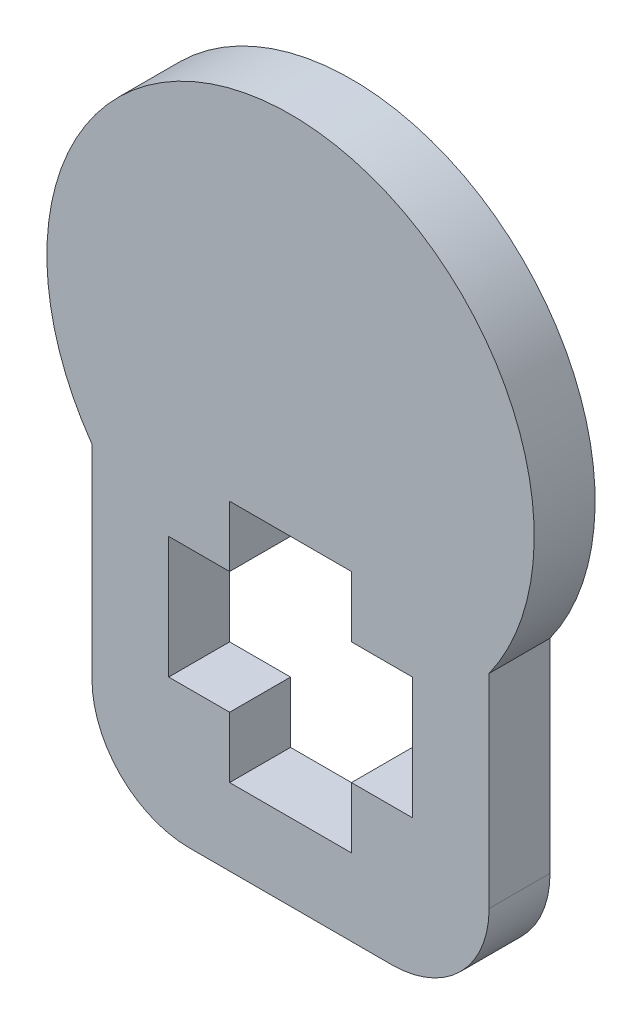
ISO-10303-21;
HEADER;
FILE_DESCRIPTION(('STEP AP214'),'2;1');
FILE_NAME('part.step','',(''),(''),'','','');
FILE_SCHEMA(('AUTOMOTIVE_DESIGN { 1 0 10303 214 1 1 1 1 }'));
ENDSEC;
DATA;
#1=APPLICATION_CONTEXT('core data for automotive mechanical design processes');
#2=APPLICATION_PROTOCOL_DEFINITION('international standard','automotive_design',2000,#1);
#3=PRODUCT_CONTEXT('',#1,'mechanical');
#4=PRODUCT('Part','Part','',(#3));
#5=PRODUCT_RELATED_PRODUCT_CATEGORY('part','',(#4));
#6=PRODUCT_DEFINITION_FORMATION('','',#4);
#7=PRODUCT_DEFINITION_CONTEXT('part definition',#1,'design');
#8=PRODUCT_DEFINITION('design','',#6,#7);
#9=PRODUCT_DEFINITION_SHAPE('','',#8);
#10=(LENGTH_UNIT() NAMED_UNIT(*) SI_UNIT(.MILLI.,.METRE.));
#11=(NAMED_UNIT(*) PLANE_ANGLE_UNIT() SI_UNIT($,.RADIAN.));
#12=(NAMED_UNIT(*) SI_UNIT($,.STERADIAN.) SOLID_ANGLE_UNIT());
#13=UNCERTAINTY_MEASURE_WITH_UNIT(LENGTH_MEASURE(1.E-05),#10,'distance_accuracy_value','');
#14=(GEOMETRIC_REPRESENTATION_CONTEXT(3) GLOBAL_UNCERTAINTY_ASSIGNED_CONTEXT((#13)) GLOBAL_UNIT_ASSIGNED_CONTEXT((#10,
#11,#12)) REPRESENTATION_CONTEXT('',''));
#15=CARTESIAN_POINT('',(0.,0.,0.));
#16=DIRECTION('',(0.,0.,1.));
#17=DIRECTION('',(1.,0.,0.));
#18=AXIS2_PLACEMENT_3D('',#15,#16,#17);
#19=CARTESIAN_POINT('',(0.,6.35,1.5875));
#20=DIRECTION('',(0.,0.,1.));
#21=DIRECTION('',(1.,0.,0.));
#22=AXIS2_PLACEMENT_3D('',#19,#20,#21);
#23=PLANE('',#22);
#24=DIRECTION('',(1.,0.,0.));
#25=VECTOR('',#24,1.);
#26=CARTESIAN_POINT('',(-5.175,-5.175,1.5875));
#27=LINE('',#26,#25);
#28=CARTESIAN_POINT('',(-2.635,-5.175,1.5875));
#29=VERTEX_POINT('',#28);
#30=CARTESIAN_POINT('',(2.635,-5.175,1.5875));
#31=VERTEX_POINT('',#30);
#32=EDGE_CURVE('E264',#29,#31,#27,.T.);
#33=ORIENTED_EDGE('',*,*,#32,.T.);
#34=CARTESIAN_POINT('',(2.635,-2.635,1.5875));
#35=DIRECTION('',(0.,0.,1.));
#36=DIRECTION('',(1.,0.,0.));
#37=AXIS2_PLACEMENT_3D('',#34,#35,#36);
#38=CIRCLE('',#37,2.54);
#39=CARTESIAN_POINT('',(5.175,-2.635,1.5875));
#40=VERTEX_POINT('',#39);
#41=EDGE_CURVE('E41',#31,#40,#38,.T.);
#42=ORIENTED_EDGE('',*,*,#41,.T.);
#43=DIRECTION('',(0.,1.,0.));
#44=VECTOR('',#43,1.);
#45=CARTESIAN_POINT('',(5.175,-5.175,1.5875));
#46=LINE('',#45,#44);
#47=CARTESIAN_POINT('',(5.175,2.67007133221309,1.5875));
#48=VERTEX_POINT('',#47);
#49=EDGE_CURVE('E266',#40,#48,#46,.T.);
#50=ORIENTED_EDGE('',*,*,#49,.T.);
#51=CARTESIAN_POINT('',(0.,6.35,1.5875));
#52=DIRECTION('',(0.,0.,1.));
#53=DIRECTION('',(1.,0.,0.));
#54=AXIS2_PLACEMENT_3D('',#51,#52,#53);
#55=CIRCLE('',#54,6.35);
#56=CARTESIAN_POINT('',(-5.175,2.67007133221309,1.5875));
#57=VERTEX_POINT('',#56);
#58=EDGE_CURVE('E258',#48,#57,#55,.T.);
#59=ORIENTED_EDGE('',*,*,#58,.T.);
#60=DIRECTION('',(0.,-1.,0.));
#61=VECTOR('',#60,1.);
#62=CARTESIAN_POINT('',(-5.175,2.67007133221309,1.5875));
#63=LINE('',#62,#61);
#64=CARTESIAN_POINT('',(-5.175,-2.635,1.5875));
#65=VERTEX_POINT('',#64);
#66=EDGE_CURVE('E261',#57,#65,#63,.T.);
#67=ORIENTED_EDGE('',*,*,#66,.T.);
#68=CARTESIAN_POINT('',(-2.635,-2.635,1.5875));
#69=DIRECTION('',(0.,0.,1.));
#70=DIRECTION('',(1.,0.,0.));
#71=AXIS2_PLACEMENT_3D('',#68,#69,#70);
#72=CIRCLE('',#71,2.54);
#73=EDGE_CURVE('E292',#65,#29,#72,.T.);
#74=ORIENTED_EDGE('',*,*,#73,.T.);
#75=EDGE_LOOP('',(#33,#42,#50,#59,#67,#74));
#76=FACE_BOUND('',#75,.T.);
#77=DIRECTION('',(1.,0.,0.));
#78=VECTOR('',#77,1.);
#79=CARTESIAN_POINT('',(-1.5875,-3.175,1.5875));
#80=LINE('',#79,#78);
#81=CARTESIAN_POINT('',(-1.5875,-3.175,1.5875));
#82=VERTEX_POINT('',#81);
#83=CARTESIAN_POINT('',(1.5875,-3.175,1.5875));
#84=VERTEX_POINT('',#83);
#85=EDGE_CURVE('E170',#82,#84,#80,.T.);
#86=ORIENTED_EDGE('',*,*,#85,.F.);
#87=DIRECTION('',(0.,-1.,0.));
#88=VECTOR('',#87,1.);
#89=CARTESIAN_POINT('',(-1.5875,-1.5875,1.5875));
#90=LINE('',#89,#88);
#91=CARTESIAN_POINT('',(-1.5875,-1.5875,1.5875));
#92=VERTEX_POINT('',#91);
#93=EDGE_CURVE('E160',#92,#82,#90,.T.);
#94=ORIENTED_EDGE('',*,*,#93,.F.);
#95=DIRECTION('',(1.,0.,0.));
#96=VECTOR('',#95,1.);
#97=CARTESIAN_POINT('',(-3.175,-1.5875,1.5875));
#98=LINE('',#97,#96);
#99=CARTESIAN_POINT('',(-3.175,-1.5875,1.5875));
#100=VERTEX_POINT('',#99);
#101=EDGE_CURVE('E204',#100,#92,#98,.T.);
#102=ORIENTED_EDGE('',*,*,#101,.F.);
#103=DIRECTION('',(0.,-1.,0.));
#104=VECTOR('',#103,1.);
#105=CARTESIAN_POINT('',(-3.175,-1.5875,1.5875));
#106=LINE('',#105,#104);
#107=CARTESIAN_POINT('',(-3.175,1.5875,1.5875));
#108=VERTEX_POINT('',#107);
#109=EDGE_CURVE('E201',#108,#100,#106,.T.);
#110=ORIENTED_EDGE('',*,*,#109,.F.);
#111=DIRECTION('',(-1.,0.,0.));
#112=VECTOR('',#111,1.);
#113=CARTESIAN_POINT('',(-3.175,1.5875,1.5875));
#114=LINE('',#113,#112);
#115=CARTESIAN_POINT('',(-1.5875,1.5875,1.5875));
#116=VERTEX_POINT('',#115);
#117=EDGE_CURVE('E199',#116,#108,#114,.T.);
#118=ORIENTED_EDGE('',*,*,#117,.F.);
#119=DIRECTION('',(0.,-1.,0.));
#120=VECTOR('',#119,1.);
#121=CARTESIAN_POINT('',(-1.5875,1.5875,1.5875));
#122=LINE('',#121,#120);
#123=CARTESIAN_POINT('',(-1.5875,3.175,1.5875));
#124=VERTEX_POINT('',#123);
#125=EDGE_CURVE('E197',#124,#116,#122,.T.);
#126=ORIENTED_EDGE('',*,*,#125,.F.);
#127=DIRECTION('',(-1.,0.,0.));
#128=VECTOR('',#127,1.);
#129=CARTESIAN_POINT('',(-1.5875,3.175,1.5875));
#130=LINE('',#129,#128);
#131=CARTESIAN_POINT('',(1.5875,3.175,1.5875));
#132=VERTEX_POINT('',#131);
#133=EDGE_CURVE('E195',#132,#124,#130,.T.);
#134=ORIENTED_EDGE('',*,*,#133,.F.);
#135=DIRECTION('',(0.,1.,0.));
#136=VECTOR('',#135,1.);
#137=CARTESIAN_POINT('',(1.5875,1.5875,1.5875));
#138=LINE('',#137,#136);
#139=CARTESIAN_POINT('',(1.5875,1.5875,1.5875));
#140=VERTEX_POINT('',#139);
#141=EDGE_CURVE('E193',#140,#132,#138,.T.);
#142=ORIENTED_EDGE('',*,*,#141,.F.);
#143=DIRECTION('',(-1.,0.,0.));
#144=VECTOR('',#143,1.);
#145=CARTESIAN_POINT('',(3.175,1.5875,1.5875));
#146=LINE('',#145,#144);
#147=CARTESIAN_POINT('',(3.175,1.5875,1.5875));
#148=VERTEX_POINT('',#147);
#149=EDGE_CURVE('E191',#148,#140,#146,.T.);
#150=ORIENTED_EDGE('',*,*,#149,.F.);
#151=DIRECTION('',(0.,1.,0.));
#152=VECTOR('',#151,1.);
#153=CARTESIAN_POINT('',(3.175,-1.5875,1.5875));
#154=LINE('',#153,#152);
#155=CARTESIAN_POINT('',(3.175,-1.5875,1.5875));
#156=VERTEX_POINT('',#155);
#157=EDGE_CURVE('E189',#156,#148,#154,.T.);
#158=ORIENTED_EDGE('',*,*,#157,.F.);
#159=DIRECTION('',(1.,0.,0.));
#160=VECTOR('',#159,1.);
#161=CARTESIAN_POINT('',(3.175,-1.5875,1.5875));
#162=LINE('',#161,#160);
#163=CARTESIAN_POINT('',(1.5875,-1.5875,1.5875));
#164=VERTEX_POINT('',#163);
#165=EDGE_CURVE('E185',#164,#156,#162,.T.);
#166=ORIENTED_EDGE('',*,*,#165,.F.);
#167=DIRECTION('',(0.,1.,0.));
#168=VECTOR('',#167,1.);
#169=CARTESIAN_POINT('',(1.5875,-1.5875,1.5875));
#170=LINE('',#169,#168);
#171=EDGE_CURVE('E183',#84,#164,#170,.T.);
#172=ORIENTED_EDGE('',*,*,#171,.F.);
#173=EDGE_LOOP('',(#86,#94,#102,#110,#118,#126,#134,#142,#150,#158,#166,#172));
#174=FACE_BOUND('',#173,.T.);
#175=ADVANCED_FACE('F33',(#76,#174),#23,.T.);
#176=CARTESIAN_POINT('',(0.,6.35,0.));
#177=DIRECTION('',(0.,0.,1.));
#178=DIRECTION('',(1.,0.,0.));
#179=AXIS2_PLACEMENT_3D('',#176,#177,#178);
#180=PLANE('',#179);
#181=DIRECTION('',(0.,1.,0.));
#182=VECTOR('',#181,1.);
#183=CARTESIAN_POINT('',(5.175,-5.175,0.));
#184=LINE('',#183,#182);
#185=CARTESIAN_POINT('',(5.175,-2.635,0.));
#186=VERTEX_POINT('',#185);
#187=CARTESIAN_POINT('',(5.175,2.67007133221309,0.));
#188=VERTEX_POINT('',#187);
#189=EDGE_CURVE('E262',#186,#188,#184,.T.);
#190=ORIENTED_EDGE('',*,*,#189,.F.);
#191=CARTESIAN_POINT('',(2.635,-2.635,0.));
#192=DIRECTION('',(0.,0.,1.));
#193=DIRECTION('',(1.,0.,0.));
#194=AXIS2_PLACEMENT_3D('',#191,#192,#193);
#195=CIRCLE('',#194,2.54);
#196=CARTESIAN_POINT('',(2.635,-5.175,0.));
#197=VERTEX_POINT('',#196);
#198=EDGE_CURVE('E286',#186,#197,#195,.F.);
#199=ORIENTED_EDGE('',*,*,#198,.T.);
#200=DIRECTION('',(1.,0.,0.));
#201=VECTOR('',#200,1.);
#202=CARTESIAN_POINT('',(-5.175,-5.175,0.));
#203=LINE('',#202,#201);
#204=CARTESIAN_POINT('',(-2.635,-5.175,0.));
#205=VERTEX_POINT('',#204);
#206=EDGE_CURVE('E273',#205,#197,#203,.T.);
#207=ORIENTED_EDGE('',*,*,#206,.F.);
#208=CARTESIAN_POINT('',(-2.635,-2.635,0.));
#209=DIRECTION('',(0.,0.,1.));
#210=DIRECTION('',(1.,0.,0.));
#211=AXIS2_PLACEMENT_3D('',#208,#209,#210);
#212=CIRCLE('',#211,2.54);
#213=CARTESIAN_POINT('',(-5.175,-2.635,0.));
#214=VERTEX_POINT('',#213);
#215=EDGE_CURVE('E284',#205,#214,#212,.F.);
#216=ORIENTED_EDGE('',*,*,#215,.T.);
#217=DIRECTION('',(0.,-1.,0.));
#218=VECTOR('',#217,1.);
#219=CARTESIAN_POINT('',(-5.175,2.67007133221309,0.));
#220=LINE('',#219,#218);
#221=CARTESIAN_POINT('',(-5.175,2.67007133221309,0.));
#222=VERTEX_POINT('',#221);
#223=EDGE_CURVE('E271',#222,#214,#220,.T.);
#224=ORIENTED_EDGE('',*,*,#223,.F.);
#225=CARTESIAN_POINT('',(0.,6.35,0.));
#226=DIRECTION('',(0.,0.,1.));
#227=DIRECTION('',(1.,0.,0.));
#228=AXIS2_PLACEMENT_3D('',#225,#226,#227);
#229=CIRCLE('',#228,6.35);
#230=EDGE_CURVE('E178',#188,#222,#229,.T.);
#231=ORIENTED_EDGE('',*,*,#230,.F.);
#232=EDGE_LOOP('',(#190,#199,#207,#216,#224,#231));
#233=FACE_BOUND('',#232,.T.);
#234=DIRECTION('',(0.,-1.,0.));
#235=VECTOR('',#234,1.);
#236=CARTESIAN_POINT('',(-1.5875,-1.5875,0.));
#237=LINE('',#236,#235);
#238=CARTESIAN_POINT('',(-1.5875,-1.5875,0.));
#239=VERTEX_POINT('',#238);
#240=CARTESIAN_POINT('',(-1.5875,-3.175,0.));
#241=VERTEX_POINT('',#240);
#242=EDGE_CURVE('E206',#239,#241,#237,.T.);
#243=ORIENTED_EDGE('',*,*,#242,.T.);
#244=DIRECTION('',(1.,0.,0.));
#245=VECTOR('',#244,1.);
#246=CARTESIAN_POINT('',(-1.5875,-3.175,0.));
#247=LINE('',#246,#245);
#248=CARTESIAN_POINT('',(1.5875,-3.175,0.));
#249=VERTEX_POINT('',#248);
#250=EDGE_CURVE('E177',#241,#249,#247,.T.);
#251=ORIENTED_EDGE('',*,*,#250,.T.);
#252=DIRECTION('',(0.,1.,0.));
#253=VECTOR('',#252,1.);
#254=CARTESIAN_POINT('',(1.5875,-1.5875,0.));
#255=LINE('',#254,#253);
#256=CARTESIAN_POINT('',(1.5875,-1.5875,0.));
#257=VERTEX_POINT('',#256);
#258=EDGE_CURVE('E209',#249,#257,#255,.T.);
#259=ORIENTED_EDGE('',*,*,#258,.T.);
#260=DIRECTION('',(1.,0.,0.));
#261=VECTOR('',#260,1.);
#262=CARTESIAN_POINT('',(3.175,-1.5875,0.));
#263=LINE('',#262,#261);
#264=CARTESIAN_POINT('',(3.175,-1.5875,0.));
#265=VERTEX_POINT('',#264);
#266=EDGE_CURVE('E212',#257,#265,#263,.T.);
#267=ORIENTED_EDGE('',*,*,#266,.T.);
#268=DIRECTION('',(0.,1.,0.));
#269=VECTOR('',#268,1.);
#270=CARTESIAN_POINT('',(3.175,-1.5875,0.));
#271=LINE('',#270,#269);
#272=CARTESIAN_POINT('',(3.175,1.5875,0.));
#273=VERTEX_POINT('',#272);
#274=EDGE_CURVE('E215',#265,#273,#271,.T.);
#275=ORIENTED_EDGE('',*,*,#274,.T.);
#276=DIRECTION('',(-1.,0.,0.));
#277=VECTOR('',#276,1.);
#278=CARTESIAN_POINT('',(3.175,1.5875,0.));
#279=LINE('',#278,#277);
#280=CARTESIAN_POINT('',(1.5875,1.5875,0.));
#281=VERTEX_POINT('',#280);
#282=EDGE_CURVE('E218',#273,#281,#279,.T.);
#283=ORIENTED_EDGE('',*,*,#282,.T.);
#284=DIRECTION('',(0.,1.,0.));
#285=VECTOR('',#284,1.);
#286=CARTESIAN_POINT('',(1.5875,1.5875,0.));
#287=LINE('',#286,#285);
#288=CARTESIAN_POINT('',(1.5875,3.175,0.));
#289=VERTEX_POINT('',#288);
#290=EDGE_CURVE('E221',#281,#289,#287,.T.);
#291=ORIENTED_EDGE('',*,*,#290,.T.);
#292=DIRECTION('',(-1.,0.,0.));
#293=VECTOR('',#292,1.);
#294=CARTESIAN_POINT('',(-1.5875,3.175,0.));
#295=LINE('',#294,#293);
#296=CARTESIAN_POINT('',(-1.5875,3.175,0.));
#297=VERTEX_POINT('',#296);
#298=EDGE_CURVE('E224',#289,#297,#295,.T.);
#299=ORIENTED_EDGE('',*,*,#298,.T.);
#300=DIRECTION('',(0.,-1.,0.));
#301=VECTOR('',#300,1.);
#302=CARTESIAN_POINT('',(-1.5875,1.5875,0.));
#303=LINE('',#302,#301);
#304=CARTESIAN_POINT('',(-1.5875,1.5875,0.));
#305=VERTEX_POINT('',#304);
#306=EDGE_CURVE('E227',#297,#305,#303,.T.);
#307=ORIENTED_EDGE('',*,*,#306,.T.);
#308=DIRECTION('',(-1.,0.,0.));
#309=VECTOR('',#308,1.);
#310=CARTESIAN_POINT('',(-3.175,1.5875,0.));
#311=LINE('',#310,#309);
#312=CARTESIAN_POINT('',(-3.175,1.5875,0.));
#313=VERTEX_POINT('',#312);
#314=EDGE_CURVE('E230',#305,#313,#311,.T.);
#315=ORIENTED_EDGE('',*,*,#314,.T.);
#316=DIRECTION('',(0.,-1.,0.));
#317=VECTOR('',#316,1.);
#318=CARTESIAN_POINT('',(-3.175,-1.5875,0.));
#319=LINE('',#318,#317);
#320=CARTESIAN_POINT('',(-3.175,-1.5875,0.));
#321=VERTEX_POINT('',#320);
#322=EDGE_CURVE('E233',#313,#321,#319,.T.);
#323=ORIENTED_EDGE('',*,*,#322,.T.);
#324=DIRECTION('',(1.,0.,0.));
#325=VECTOR('',#324,1.);
#326=CARTESIAN_POINT('',(-3.175,-1.5875,0.));
#327=LINE('',#326,#325);
#328=EDGE_CURVE('E171',#321,#239,#327,.T.);
#329=ORIENTED_EDGE('',*,*,#328,.T.);
#330=EDGE_LOOP('',(#243,#251,#259,#267,#275,#283,#291,#299,#307,#315,#323,#329));
#331=FACE_BOUND('',#330,.T.);
#332=ADVANCED_FACE('F306',(#233,#331),#180,.F.);
#333=CARTESIAN_POINT('',(0.,6.35,1.5875));
#334=DIRECTION('',(0.,0.,-1.));
#335=DIRECTION('',(-1.,0.,0.));
#336=AXIS2_PLACEMENT_3D('',#333,#334,#335);
#337=CYLINDRICAL_SURFACE('',#336,6.35);
#338=ORIENTED_EDGE('',*,*,#230,.T.);
#339=DIRECTION('',(0.,0.,-1.));
#340=VECTOR('',#339,1.);
#341=CARTESIAN_POINT('',(-5.175,2.67007133221309,1.5875));
#342=LINE('',#341,#340);
#343=EDGE_CURVE('E278',#57,#222,#342,.T.);
#344=ORIENTED_EDGE('',*,*,#343,.F.);
#345=ORIENTED_EDGE('',*,*,#58,.F.);
#346=DIRECTION('',(0.,0.,-1.));
#347=VECTOR('',#346,1.);
#348=CARTESIAN_POINT('',(5.175,2.67007133221309,1.5875));
#349=LINE('',#348,#347);
#350=EDGE_CURVE('E268',#48,#188,#349,.T.);
#351=ORIENTED_EDGE('',*,*,#350,.T.);
#352=EDGE_LOOP('',(#338,#344,#345,#351));
#353=FACE_BOUND('',#352,.T.);
#354=ADVANCED_FACE('F316',(#353),#337,.T.);
#355=CARTESIAN_POINT('',(-5.175,2.67007133221309,1.5875));
#356=DIRECTION('',(1.,0.,0.));
#357=DIRECTION('',(0.,1.,0.));
#358=AXIS2_PLACEMENT_3D('',#355,#356,#357);
#359=PLANE('',#358);
#360=ORIENTED_EDGE('',*,*,#223,.T.);
#361=DIRECTION('',(0.,0.,-1.));
#362=VECTOR('',#361,1.);
#363=CARTESIAN_POINT('',(-5.175,-2.635,1.5875));
#364=LINE('',#363,#362);
#365=EDGE_CURVE('E11',#214,#65,#364,.F.);
#366=ORIENTED_EDGE('',*,*,#365,.T.);
#367=ORIENTED_EDGE('',*,*,#66,.F.);
#368=ORIENTED_EDGE('',*,*,#343,.T.);
#369=EDGE_LOOP('',(#360,#366,#367,#368));
#370=FACE_BOUND('',#369,.T.);
#371=ADVANCED_FACE('F313',(#370),#359,.F.);
#372=CARTESIAN_POINT('',(-5.175,-5.175,1.5875));
#373=DIRECTION('',(0.,1.,0.));
#374=DIRECTION('',(-1.,0.,0.));
#375=AXIS2_PLACEMENT_3D('',#372,#373,#374);
#376=PLANE('',#375);
#377=ORIENTED_EDGE('',*,*,#206,.T.);
#378=DIRECTION('',(0.,0.,-1.));
#379=VECTOR('',#378,1.);
#380=CARTESIAN_POINT('',(2.635,-5.175,1.5875));
#381=LINE('',#380,#379);
#382=EDGE_CURVE('E54',#197,#31,#381,.F.);
#383=ORIENTED_EDGE('',*,*,#382,.T.);
#384=ORIENTED_EDGE('',*,*,#32,.F.);
#385=DIRECTION('',(0.,0.,-1.));
#386=VECTOR('',#385,1.);
#387=CARTESIAN_POINT('',(-2.635,-5.175,1.5875));
#388=LINE('',#387,#386);
#389=EDGE_CURVE('E288',#29,#205,#388,.T.);
#390=ORIENTED_EDGE('',*,*,#389,.T.);
#391=EDGE_LOOP('',(#377,#383,#384,#390));
#392=FACE_BOUND('',#391,.T.);
#393=ADVANCED_FACE('F309',(#392),#376,.F.);
#394=CARTESIAN_POINT('',(5.175,-5.175,1.5875));
#395=DIRECTION('',(-1.,0.,0.));
#396=DIRECTION('',(0.,-1.,0.));
#397=AXIS2_PLACEMENT_3D('',#394,#395,#396);
#398=PLANE('',#397);
#399=ORIENTED_EDGE('',*,*,#49,.F.);
#400=DIRECTION('',(0.,0.,-1.));
#401=VECTOR('',#400,1.);
#402=CARTESIAN_POINT('',(5.175,-2.635,1.5875));
#403=LINE('',#402,#401);
#404=EDGE_CURVE('E281',#40,#186,#403,.T.);
#405=ORIENTED_EDGE('',*,*,#404,.T.);
#406=ORIENTED_EDGE('',*,*,#189,.T.);
#407=ORIENTED_EDGE('',*,*,#350,.F.);
#408=EDGE_LOOP('',(#399,#405,#406,#407));
#409=FACE_BOUND('',#408,.T.);
#410=ADVANCED_FACE('F300',(#409),#398,.F.);
#411=CARTESIAN_POINT('',(-1.5875,-1.5875,1.5875));
#412=DIRECTION('',(1.,0.,0.));
#413=DIRECTION('',(0.,1.,0.));
#414=AXIS2_PLACEMENT_3D('',#411,#412,#413);
#415=PLANE('',#414);
#416=ORIENTED_EDGE('',*,*,#242,.F.);
#417=DIRECTION('',(0.,0.,-1.));
#418=VECTOR('',#417,1.);
#419=CARTESIAN_POINT('',(-1.5875,-1.5875,1.5875));
#420=LINE('',#419,#418);
#421=EDGE_CURVE('E166',#92,#239,#420,.T.);
#422=ORIENTED_EDGE('',*,*,#421,.F.);
#423=ORIENTED_EDGE('',*,*,#93,.T.);
#424=DIRECTION('',(0.,0.,-1.));
#425=VECTOR('',#424,1.);
#426=CARTESIAN_POINT('',(-1.5875,-3.175,1.5875));
#427=LINE('',#426,#425);
#428=EDGE_CURVE('E163',#82,#241,#427,.T.);
#429=ORIENTED_EDGE('',*,*,#428,.T.);
#430=EDGE_LOOP('',(#416,#422,#423,#429));
#431=FACE_BOUND('',#430,.T.);
#432=ADVANCED_FACE('F162',(#431),#415,.T.);
#433=CARTESIAN_POINT('',(-1.5875,-3.175,1.5875));
#434=DIRECTION('',(0.,1.,0.));
#435=DIRECTION('',(0.,0.,1.));
#436=AXIS2_PLACEMENT_3D('',#433,#434,#435);
#437=PLANE('',#436);
#438=ORIENTED_EDGE('',*,*,#250,.F.);
#439=ORIENTED_EDGE('',*,*,#428,.F.);
#440=ORIENTED_EDGE('',*,*,#85,.T.);
#441=DIRECTION('',(0.,0.,-1.));
#442=VECTOR('',#441,1.);
#443=CARTESIAN_POINT('',(1.5875,-3.175,1.5875));
#444=LINE('',#443,#442);
#445=EDGE_CURVE('E179',#84,#249,#444,.T.);
#446=ORIENTED_EDGE('',*,*,#445,.T.);
#447=EDGE_LOOP('',(#438,#439,#440,#446));
#448=FACE_BOUND('',#447,.T.);
#449=ADVANCED_FACE('F174',(#448),#437,.T.);
#450=CARTESIAN_POINT('',(1.5875,-1.5875,1.5875));
#451=DIRECTION('',(-1.,0.,0.));
#452=DIRECTION('',(0.,-1.,0.));
#453=AXIS2_PLACEMENT_3D('',#450,#451,#452);
#454=PLANE('',#453);
#455=ORIENTED_EDGE('',*,*,#258,.F.);
#456=ORIENTED_EDGE('',*,*,#445,.F.);
#457=ORIENTED_EDGE('',*,*,#171,.T.);
#458=DIRECTION('',(0.,0.,-1.));
#459=VECTOR('',#458,1.);
#460=CARTESIAN_POINT('',(1.5875,-1.5875,1.5875));
#461=LINE('',#460,#459);
#462=EDGE_CURVE('E255',#164,#257,#461,.T.);
#463=ORIENTED_EDGE('',*,*,#462,.T.);
#464=EDGE_LOOP('',(#455,#456,#457,#463));
#465=FACE_BOUND('',#464,.T.);
#466=ADVANCED_FACE('F355',(#465),#454,.T.);
#467=CARTESIAN_POINT('',(3.175,-1.5875,1.5875));
#468=DIRECTION('',(0.,1.,0.));
#469=DIRECTION('',(-1.,0.,0.));
#470=AXIS2_PLACEMENT_3D('',#467,#468,#469);
#471=PLANE('',#470);
#472=ORIENTED_EDGE('',*,*,#266,.F.);
#473=ORIENTED_EDGE('',*,*,#462,.F.);
#474=ORIENTED_EDGE('',*,*,#165,.T.);
#475=DIRECTION('',(0.,0.,-1.));
#476=VECTOR('',#475,1.);
#477=CARTESIAN_POINT('',(3.175,-1.5875,1.5875));
#478=LINE('',#477,#476);
#479=EDGE_CURVE('E253',#156,#265,#478,.T.);
#480=ORIENTED_EDGE('',*,*,#479,.T.);
#481=EDGE_LOOP('',(#472,#473,#474,#480));
#482=FACE_BOUND('',#481,.T.);
#483=ADVANCED_FACE('F361',(#482),#471,.T.);
#484=CARTESIAN_POINT('',(3.175,-1.5875,1.5875));
#485=DIRECTION('',(-1.,0.,0.));
#486=DIRECTION('',(0.,-1.,0.));
#487=AXIS2_PLACEMENT_3D('',#484,#485,#486);
#488=PLANE('',#487);
#489=ORIENTED_EDGE('',*,*,#274,.F.);
#490=ORIENTED_EDGE('',*,*,#479,.F.);
#491=ORIENTED_EDGE('',*,*,#157,.T.);
#492=DIRECTION('',(0.,0.,-1.));
#493=VECTOR('',#492,1.);
#494=CARTESIAN_POINT('',(3.175,1.5875,1.5875));
#495=LINE('',#494,#493);
#496=EDGE_CURVE('E251',#148,#273,#495,.T.);
#497=ORIENTED_EDGE('',*,*,#496,.T.);
#498=EDGE_LOOP('',(#489,#490,#491,#497));
#499=FACE_BOUND('',#498,.T.);
#500=ADVANCED_FACE('F369',(#499),#488,.T.);
#501=CARTESIAN_POINT('',(3.175,1.5875,1.5875));
#502=DIRECTION('',(0.,-1.,0.));
#503=DIRECTION('',(1.,0.,0.));
#504=AXIS2_PLACEMENT_3D('',#501,#502,#503);
#505=PLANE('',#504);
#506=ORIENTED_EDGE('',*,*,#282,.F.);
#507=ORIENTED_EDGE('',*,*,#496,.F.);
#508=ORIENTED_EDGE('',*,*,#149,.T.);
#509=DIRECTION('',(0.,0.,-1.));
#510=VECTOR('',#509,1.);
#511=CARTESIAN_POINT('',(1.5875,1.5875,1.5875));
#512=LINE('',#511,#510);
#513=EDGE_CURVE('E249',#140,#281,#512,.T.);
#514=ORIENTED_EDGE('',*,*,#513,.T.);
#515=EDGE_LOOP('',(#506,#507,#508,#514));
#516=FACE_BOUND('',#515,.T.);
#517=ADVANCED_FACE('F377',(#516),#505,.T.);
#518=CARTESIAN_POINT('',(1.5875,1.5875,1.5875));
#519=DIRECTION('',(-1.,0.,0.));
#520=DIRECTION('',(0.,-1.,0.));
#521=AXIS2_PLACEMENT_3D('',#518,#519,#520);
#522=PLANE('',#521);
#523=ORIENTED_EDGE('',*,*,#290,.F.);
#524=ORIENTED_EDGE('',*,*,#513,.F.);
#525=ORIENTED_EDGE('',*,*,#141,.T.);
#526=DIRECTION('',(0.,0.,-1.));
#527=VECTOR('',#526,1.);
#528=CARTESIAN_POINT('',(1.5875,3.175,1.5875));
#529=LINE('',#528,#527);
#530=EDGE_CURVE('E247',#132,#289,#529,.T.);
#531=ORIENTED_EDGE('',*,*,#530,.T.);
#532=EDGE_LOOP('',(#523,#524,#525,#531));
#533=FACE_BOUND('',#532,.T.);
#534=ADVANCED_FACE('F385',(#533),#522,.T.);
#535=CARTESIAN_POINT('',(-1.5875,3.175,1.5875));
#536=DIRECTION('',(0.,-1.,0.));
#537=DIRECTION('',(0.,0.,-1.));
#538=AXIS2_PLACEMENT_3D('',#535,#536,#537);
#539=PLANE('',#538);
#540=ORIENTED_EDGE('',*,*,#298,.F.);
#541=ORIENTED_EDGE('',*,*,#530,.F.);
#542=ORIENTED_EDGE('',*,*,#133,.T.);
#543=DIRECTION('',(0.,0.,-1.));
#544=VECTOR('',#543,1.);
#545=CARTESIAN_POINT('',(-1.5875,3.175,1.5875));
#546=LINE('',#545,#544);
#547=EDGE_CURVE('E245',#124,#297,#546,.T.);
#548=ORIENTED_EDGE('',*,*,#547,.T.);
#549=EDGE_LOOP('',(#540,#541,#542,#548));
#550=FACE_BOUND('',#549,.T.);
#551=ADVANCED_FACE('F393',(#550),#539,.T.);
#552=CARTESIAN_POINT('',(-1.5875,1.5875,1.5875));
#553=DIRECTION('',(1.,0.,0.));
#554=DIRECTION('',(0.,0.,-1.));
#555=AXIS2_PLACEMENT_3D('',#552,#553,#554);
#556=PLANE('',#555);
#557=ORIENTED_EDGE('',*,*,#306,.F.);
#558=ORIENTED_EDGE('',*,*,#547,.F.);
#559=ORIENTED_EDGE('',*,*,#125,.T.);
#560=DIRECTION('',(0.,0.,-1.));
#561=VECTOR('',#560,1.);
#562=CARTESIAN_POINT('',(-1.5875,1.5875,1.5875));
#563=LINE('',#562,#561);
#564=EDGE_CURVE('E243',#116,#305,#563,.T.);
#565=ORIENTED_EDGE('',*,*,#564,.T.);
#566=EDGE_LOOP('',(#557,#558,#559,#565));
#567=FACE_BOUND('',#566,.T.);
#568=ADVANCED_FACE('F401',(#567),#556,.T.);
#569=CARTESIAN_POINT('',(-3.175,1.5875,1.5875));
#570=DIRECTION('',(0.,-1.,0.));
#571=DIRECTION('',(1.,0.,0.));
#572=AXIS2_PLACEMENT_3D('',#569,#570,#571);
#573=PLANE('',#572);
#574=ORIENTED_EDGE('',*,*,#314,.F.);
#575=ORIENTED_EDGE('',*,*,#564,.F.);
#576=ORIENTED_EDGE('',*,*,#117,.T.);
#577=DIRECTION('',(0.,0.,-1.));
#578=VECTOR('',#577,1.);
#579=CARTESIAN_POINT('',(-3.175,1.5875,1.5875));
#580=LINE('',#579,#578);
#581=EDGE_CURVE('E241',#108,#313,#580,.T.);
#582=ORIENTED_EDGE('',*,*,#581,.T.);
#583=EDGE_LOOP('',(#574,#575,#576,#582));
#584=FACE_BOUND('',#583,.T.);
#585=ADVANCED_FACE('F409',(#584),#573,.T.);
#586=CARTESIAN_POINT('',(-3.175,-1.5875,1.5875));
#587=DIRECTION('',(1.,0.,0.));
#588=DIRECTION('',(0.,1.,0.));
#589=AXIS2_PLACEMENT_3D('',#586,#587,#588);
#590=PLANE('',#589);
#591=ORIENTED_EDGE('',*,*,#322,.F.);
#592=ORIENTED_EDGE('',*,*,#581,.F.);
#593=ORIENTED_EDGE('',*,*,#109,.T.);
#594=DIRECTION('',(0.,0.,-1.));
#595=VECTOR('',#594,1.);
#596=CARTESIAN_POINT('',(-3.175,-1.5875,1.5875));
#597=LINE('',#596,#595);
#598=EDGE_CURVE('E239',#100,#321,#597,.T.);
#599=ORIENTED_EDGE('',*,*,#598,.T.);
#600=EDGE_LOOP('',(#591,#592,#593,#599));
#601=FACE_BOUND('',#600,.T.);
#602=ADVANCED_FACE('F417',(#601),#590,.T.);
#603=CARTESIAN_POINT('',(-3.175,-1.5875,1.5875));
#604=DIRECTION('',(0.,1.,0.));
#605=DIRECTION('',(-1.,0.,0.));
#606=AXIS2_PLACEMENT_3D('',#603,#604,#605);
#607=PLANE('',#606);
#608=ORIENTED_EDGE('',*,*,#328,.F.);
#609=ORIENTED_EDGE('',*,*,#598,.F.);
#610=ORIENTED_EDGE('',*,*,#101,.T.);
#611=ORIENTED_EDGE('',*,*,#421,.T.);
#612=EDGE_LOOP('',(#608,#609,#610,#611));
#613=FACE_BOUND('',#612,.T.);
#614=ADVANCED_FACE('F425',(#613),#607,.T.);
#615=CARTESIAN_POINT('',(2.635,-2.635,1.5875));
#616=DIRECTION('',(0.,0.,-1.));
#617=DIRECTION('',(-1.,0.,0.));
#618=AXIS2_PLACEMENT_3D('',#615,#616,#617);
#619=CYLINDRICAL_SURFACE('',#618,2.54);
#620=ORIENTED_EDGE('',*,*,#41,.F.);
#621=ORIENTED_EDGE('',*,*,#382,.F.);
#622=ORIENTED_EDGE('',*,*,#198,.F.);
#623=ORIENTED_EDGE('',*,*,#404,.F.);
#624=EDGE_LOOP('',(#620,#621,#622,#623));
#625=FACE_BOUND('',#624,.T.);
#626=ADVANCED_FACE('F303',(#625),#619,.T.);
#627=CARTESIAN_POINT('',(-2.635,-2.635,1.5875));
#628=DIRECTION('',(0.,0.,-1.));
#629=DIRECTION('',(-1.,0.,0.));
#630=AXIS2_PLACEMENT_3D('',#627,#628,#629);
#631=CYLINDRICAL_SURFACE('',#630,2.54);
#632=ORIENTED_EDGE('',*,*,#73,.F.);
#633=ORIENTED_EDGE('',*,*,#365,.F.);
#634=ORIENTED_EDGE('',*,*,#215,.F.);
#635=ORIENTED_EDGE('',*,*,#389,.F.);
#636=EDGE_LOOP('',(#632,#633,#634,#635));
#637=FACE_BOUND('',#636,.T.);
#638=ADVANCED_FACE('F35',(#637),#631,.T.);
#639=CLOSED_SHELL('',(#175,#332,#354,#371,#393,#410,#432,#449,#466,#483,#500,#517,#534,#551,
#568,#585,#602,#614,#626,#638));
#640=MANIFOLD_SOLID_BREP('B2',#639);
#641=ADVANCED_BREP_SHAPE_REPRESENTATION('',(#18,#640),#14);
#642=SHAPE_DEFINITION_REPRESENTATION(#9,#641);
ENDSEC;
END-ISO-10303-21;
